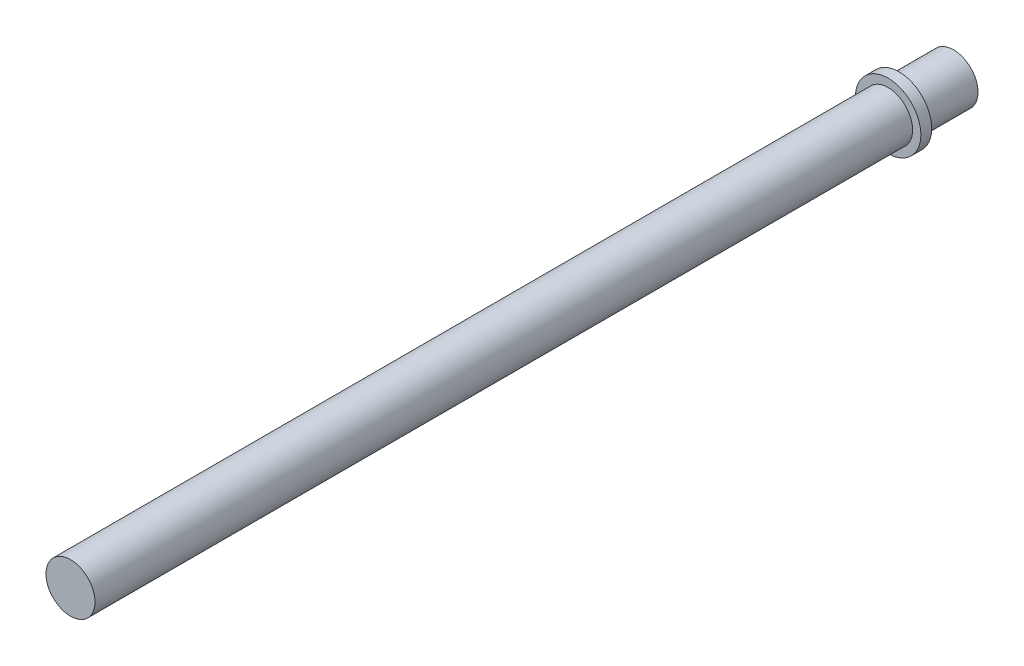
ISO-10303-21;
HEADER;
FILE_DESCRIPTION(('STEP AP214'),'2;1');
FILE_NAME('part.step','',(''),(''),'','','');
FILE_SCHEMA(('AUTOMOTIVE_DESIGN { 1 0 10303 214 1 1 1 1 }'));
ENDSEC;
DATA;
#1=APPLICATION_CONTEXT('core data for automotive mechanical design processes');
#2=APPLICATION_PROTOCOL_DEFINITION('international standard','automotive_design',2000,#1);
#3=PRODUCT_CONTEXT('',#1,'mechanical');
#4=PRODUCT('Part','Part','',(#3));
#5=PRODUCT_RELATED_PRODUCT_CATEGORY('part','',(#4));
#6=PRODUCT_DEFINITION_FORMATION('','',#4);
#7=PRODUCT_DEFINITION_CONTEXT('part definition',#1,'design');
#8=PRODUCT_DEFINITION('design','',#6,#7);
#9=PRODUCT_DEFINITION_SHAPE('','',#8);
#10=(LENGTH_UNIT() NAMED_UNIT(*) SI_UNIT(.MILLI.,.METRE.));
#11=(NAMED_UNIT(*) PLANE_ANGLE_UNIT() SI_UNIT($,.RADIAN.));
#12=(NAMED_UNIT(*) SI_UNIT($,.STERADIAN.) SOLID_ANGLE_UNIT());
#13=UNCERTAINTY_MEASURE_WITH_UNIT(LENGTH_MEASURE(1.E-05),#10,'distance_accuracy_value','');
#14=(GEOMETRIC_REPRESENTATION_CONTEXT(3) GLOBAL_UNCERTAINTY_ASSIGNED_CONTEXT((#13)) GLOBAL_UNIT_ASSIGNED_CONTEXT((#10,
#11,#12)) REPRESENTATION_CONTEXT('',''));
#15=CARTESIAN_POINT('',(0.,0.,0.));
#16=DIRECTION('',(0.,0.,1.));
#17=DIRECTION('',(1.,0.,0.));
#18=AXIS2_PLACEMENT_3D('',#15,#16,#17);
#19=CARTESIAN_POINT('',(0.,0.,75.));
#20=DIRECTION('',(0.,0.,-1.));
#21=DIRECTION('',(-1.,0.,0.));
#22=AXIS2_PLACEMENT_3D('',#19,#20,#21);
#23=CYLINDRICAL_SURFACE('',#22,2.25);
#24=CARTESIAN_POINT('',(0.,0.,75.));
#25=DIRECTION('',(0.,0.,1.));
#26=DIRECTION('',(1.,0.,0.));
#27=AXIS2_PLACEMENT_3D('',#24,#25,#26);
#28=CIRCLE('',#27,2.25);
#29=CARTESIAN_POINT('',(2.25,0.,75.));
#30=VERTEX_POINT('',#29);
#31=EDGE_CURVE('E51',#30,#30,#28,.T.);
#32=ORIENTED_EDGE('',*,*,#31,.F.);
#33=EDGE_LOOP('',(#32));
#34=FACE_BOUND('',#33,.T.);
#35=CARTESIAN_POINT('',(0.,0.,0.));
#36=DIRECTION('',(0.,0.,1.));
#37=DIRECTION('',(1.,0.,0.));
#38=AXIS2_PLACEMENT_3D('',#35,#36,#37);
#39=CIRCLE('',#38,2.25);
#40=CARTESIAN_POINT('',(2.25,0.,0.));
#41=VERTEX_POINT('',#40);
#42=EDGE_CURVE('E46',#41,#41,#39,.T.);
#43=ORIENTED_EDGE('',*,*,#42,.T.);
#44=EDGE_LOOP('',(#43));
#45=FACE_BOUND('',#44,.T.);
#46=ADVANCED_FACE('F43',(#34,#45),#23,.T.);
#47=CARTESIAN_POINT('',(0.,0.,75.));
#48=DIRECTION('',(0.,0.,1.));
#49=DIRECTION('',(1.,0.,0.));
#50=AXIS2_PLACEMENT_3D('',#47,#48,#49);
#51=PLANE('',#50);
#52=ORIENTED_EDGE('',*,*,#31,.T.);
#53=EDGE_LOOP('',(#52));
#54=FACE_BOUND('',#53,.T.);
#55=ADVANCED_FACE('F90',(#54),#51,.T.);
#56=CARTESIAN_POINT('',(0.,0.,-1.));
#57=DIRECTION('',(0.,0.,1.));
#58=DIRECTION('',(1.,0.,0.));
#59=AXIS2_PLACEMENT_3D('',#56,#57,#58);
#60=CYLINDRICAL_SURFACE('',#59,3.);
#61=CARTESIAN_POINT('',(0.,0.,-1.));
#62=DIRECTION('',(0.,0.,-1.));
#63=DIRECTION('',(-1.,0.,0.));
#64=AXIS2_PLACEMENT_3D('',#61,#62,#63);
#65=CIRCLE('',#64,3.);
#66=CARTESIAN_POINT('',(-3.,0.,-1.));
#67=VERTEX_POINT('',#66);
#68=EDGE_CURVE('E60',#67,#67,#65,.T.);
#69=ORIENTED_EDGE('',*,*,#68,.F.);
#70=EDGE_LOOP('',(#69));
#71=FACE_BOUND('',#70,.T.);
#72=CARTESIAN_POINT('',(0.,0.,0.));
#73=DIRECTION('',(0.,0.,-1.));
#74=DIRECTION('',(-1.,0.,0.));
#75=AXIS2_PLACEMENT_3D('',#72,#73,#74);
#76=CIRCLE('',#75,3.);
#77=CARTESIAN_POINT('',(-3.,0.,0.));
#78=VERTEX_POINT('',#77);
#79=EDGE_CURVE('E64',#78,#78,#76,.T.);
#80=ORIENTED_EDGE('',*,*,#79,.T.);
#81=EDGE_LOOP('',(#80));
#82=FACE_BOUND('',#81,.T.);
#83=ADVANCED_FACE('F95',(#71,#82),#60,.T.);
#84=CARTESIAN_POINT('',(0.,0.,-1.));
#85=DIRECTION('',(0.,0.,-1.));
#86=DIRECTION('',(-1.,0.,0.));
#87=AXIS2_PLACEMENT_3D('',#84,#85,#86);
#88=PLANE('',#87);
#89=CARTESIAN_POINT('',(0.,0.,-1.));
#90=DIRECTION('',(0.,0.,-1.));
#91=DIRECTION('',(-1.,0.,0.));
#92=AXIS2_PLACEMENT_3D('',#89,#90,#91);
#93=CIRCLE('',#92,2.25);
#94=CARTESIAN_POINT('',(-2.25,0.,-1.));
#95=VERTEX_POINT('',#94);
#96=EDGE_CURVE('E10',#95,#95,#93,.T.);
#97=ORIENTED_EDGE('',*,*,#96,.F.);
#98=EDGE_LOOP('',(#97));
#99=FACE_BOUND('',#98,.T.);
#100=ORIENTED_EDGE('',*,*,#68,.T.);
#101=EDGE_LOOP('',(#100));
#102=FACE_BOUND('',#101,.T.);
#103=ADVANCED_FACE('F85',(#99,#102),#88,.T.);
#104=CARTESIAN_POINT('',(0.,0.,0.));
#105=DIRECTION('',(0.,0.,-1.));
#106=DIRECTION('',(-1.,0.,0.));
#107=AXIS2_PLACEMENT_3D('',#104,#105,#106);
#108=PLANE('',#107);
#109=ORIENTED_EDGE('',*,*,#42,.F.);
#110=EDGE_LOOP('',(#109));
#111=FACE_BOUND('',#110,.T.);
#112=ORIENTED_EDGE('',*,*,#79,.F.);
#113=EDGE_LOOP('',(#112));
#114=FACE_BOUND('',#113,.T.);
#115=ADVANCED_FACE('F77',(#111,#114),#108,.F.);
#116=CARTESIAN_POINT('',(0.,0.,-6.));
#117=DIRECTION('',(0.,0.,1.));
#118=DIRECTION('',(1.,0.,0.));
#119=AXIS2_PLACEMENT_3D('',#116,#117,#118);
#120=CYLINDRICAL_SURFACE('',#119,2.25);
#121=CARTESIAN_POINT('',(0.,0.,-6.));
#122=DIRECTION('',(0.,0.,-1.));
#123=DIRECTION('',(-1.,0.,0.));
#124=AXIS2_PLACEMENT_3D('',#121,#122,#123);
#125=CIRCLE('',#124,2.25);
#126=CARTESIAN_POINT('',(-2.25,0.,-6.));
#127=VERTEX_POINT('',#126);
#128=EDGE_CURVE('E59',#127,#127,#125,.T.);
#129=ORIENTED_EDGE('',*,*,#128,.F.);
#130=EDGE_LOOP('',(#129));
#131=FACE_BOUND('',#130,.T.);
#132=ORIENTED_EDGE('',*,*,#96,.T.);
#133=EDGE_LOOP('',(#132));
#134=FACE_BOUND('',#133,.T.);
#135=ADVANCED_FACE('F75',(#131,#134),#120,.T.);
#136=CARTESIAN_POINT('',(0.,0.,-6.));
#137=DIRECTION('',(0.,0.,-1.));
#138=DIRECTION('',(-1.,0.,0.));
#139=AXIS2_PLACEMENT_3D('',#136,#137,#138);
#140=PLANE('',#139);
#141=ORIENTED_EDGE('',*,*,#128,.T.);
#142=EDGE_LOOP('',(#141));
#143=FACE_BOUND('',#142,.T.);
#144=ADVANCED_FACE('F73',(#143),#140,.T.);
#145=CLOSED_SHELL('',(#46,#55,#83,#103,#115,#135,#144));
#146=MANIFOLD_SOLID_BREP('B2',#145);
#147=ADVANCED_BREP_SHAPE_REPRESENTATION('',(#18,#146),#14);
#148=SHAPE_DEFINITION_REPRESENTATION(#9,#147);
ENDSEC;
END-ISO-10303-21;
